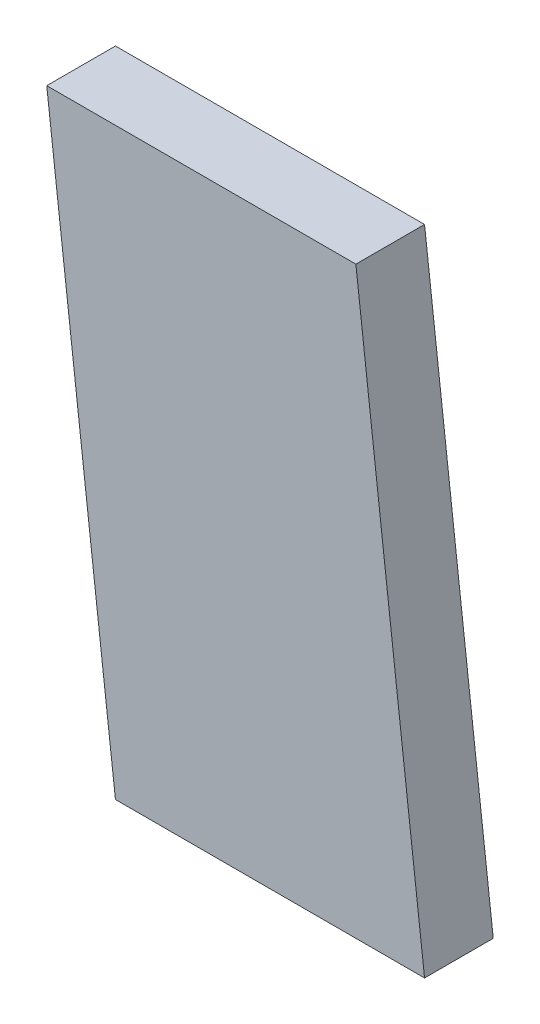
ISO-10303-21;
HEADER;
FILE_DESCRIPTION(('STEP AP214'),'2;1');
FILE_NAME('part.step','',(''),(''),'','','');
FILE_SCHEMA(('AUTOMOTIVE_DESIGN { 1 0 10303 214 1 1 1 1 }'));
ENDSEC;
DATA;
#1=APPLICATION_CONTEXT('core data for automotive mechanical design processes');
#2=APPLICATION_PROTOCOL_DEFINITION('international standard','automotive_design',2000,#1);
#3=PRODUCT_CONTEXT('',#1,'mechanical');
#4=PRODUCT('Part','Part','',(#3));
#5=PRODUCT_RELATED_PRODUCT_CATEGORY('part','',(#4));
#6=PRODUCT_DEFINITION_FORMATION('','',#4);
#7=PRODUCT_DEFINITION_CONTEXT('part definition',#1,'design');
#8=PRODUCT_DEFINITION('design','',#6,#7);
#9=PRODUCT_DEFINITION_SHAPE('','',#8);
#10=(LENGTH_UNIT() NAMED_UNIT(*) SI_UNIT(.MILLI.,.METRE.));
#11=(NAMED_UNIT(*) PLANE_ANGLE_UNIT() SI_UNIT($,.RADIAN.));
#12=(NAMED_UNIT(*) SI_UNIT($,.STERADIAN.) SOLID_ANGLE_UNIT());
#13=UNCERTAINTY_MEASURE_WITH_UNIT(LENGTH_MEASURE(1.E-05),#10,'distance_accuracy_value','');
#14=(GEOMETRIC_REPRESENTATION_CONTEXT(3) GLOBAL_UNCERTAINTY_ASSIGNED_CONTEXT((#13)) GLOBAL_UNIT_ASSIGNED_CONTEXT((#10,
#11,#12)) REPRESENTATION_CONTEXT('',''));
#15=CARTESIAN_POINT('',(0.,0.,0.));
#16=DIRECTION('',(0.,0.,1.));
#17=DIRECTION('',(1.,0.,0.));
#18=AXIS2_PLACEMENT_3D('',#15,#16,#17);
#19=CARTESIAN_POINT('',(5290.,490.,20.));
#20=DIRECTION('',(0.,1.,0.));
#21=DIRECTION('',(0.,0.,1.));
#22=AXIS2_PLACEMENT_3D('',#19,#20,#21);
#23=PLANE('',#22);
#24=DIRECTION('',(1.,0.,0.));
#25=VECTOR('',#24,1.);
#26=CARTESIAN_POINT('',(5290.,490.,0.));
#27=LINE('',#26,#25);
#28=CARTESIAN_POINT('',(5200.,490.,0.));
#29=VERTEX_POINT('',#28);
#30=CARTESIAN_POINT('',(5290.,490.,0.));
#31=VERTEX_POINT('',#30);
#32=EDGE_CURVE('E105',#29,#31,#27,.T.);
#33=ORIENTED_EDGE('',*,*,#32,.T.);
#34=DIRECTION('',(0.,0.,-1.));
#35=VECTOR('',#34,1.);
#36=CARTESIAN_POINT('',(5290.,490.,20.));
#37=LINE('',#36,#35);
#38=CARTESIAN_POINT('',(5290.,490.,20.));
#39=VERTEX_POINT('',#38);
#40=EDGE_CURVE('E11',#39,#31,#37,.T.);
#41=ORIENTED_EDGE('',*,*,#40,.F.);
#42=DIRECTION('',(1.,0.,0.));
#43=VECTOR('',#42,1.);
#44=CARTESIAN_POINT('',(5290.,490.,20.));
#45=LINE('',#44,#43);
#46=CARTESIAN_POINT('',(5200.,490.,20.));
#47=VERTEX_POINT('',#46);
#48=EDGE_CURVE('E89',#47,#39,#45,.T.);
#49=ORIENTED_EDGE('',*,*,#48,.F.);
#50=DIRECTION('',(0.,0.,-1.));
#51=VECTOR('',#50,1.);
#52=CARTESIAN_POINT('',(5200.,490.,20.));
#53=LINE('',#52,#51);
#54=EDGE_CURVE('E97',#47,#29,#53,.T.);
#55=ORIENTED_EDGE('',*,*,#54,.T.);
#56=EDGE_LOOP('',(#33,#41,#49,#55));
#57=FACE_BOUND('',#56,.T.);
#58=ADVANCED_FACE('F39',(#57),#23,.F.);
#59=CARTESIAN_POINT('',(5270.,660.,20.));
#60=DIRECTION('',(-0.993150604322876,-0.1168412475674,0.));
#61=DIRECTION('',(0.1168412475674,-0.993150604322876,0.));
#62=AXIS2_PLACEMENT_3D('',#59,#60,#61);
#63=PLANE('',#62);
#64=DIRECTION('',(-0.1168412475674,0.993150604322876,0.));
#65=VECTOR('',#64,1.);
#66=CARTESIAN_POINT('',(5270.,660.,0.));
#67=LINE('',#66,#65);
#68=CARTESIAN_POINT('',(5270.,660.,0.));
#69=VERTEX_POINT('',#68);
#70=EDGE_CURVE('E92',#31,#69,#67,.T.);
#71=ORIENTED_EDGE('',*,*,#70,.T.);
#72=DIRECTION('',(0.,0.,-1.));
#73=VECTOR('',#72,1.);
#74=CARTESIAN_POINT('',(5270.,660.,20.));
#75=LINE('',#74,#73);
#76=CARTESIAN_POINT('',(5270.,660.,20.));
#77=VERTEX_POINT('',#76);
#78=EDGE_CURVE('E50',#77,#69,#75,.T.);
#79=ORIENTED_EDGE('',*,*,#78,.F.);
#80=DIRECTION('',(-0.1168412475674,0.993150604322876,0.));
#81=VECTOR('',#80,1.);
#82=CARTESIAN_POINT('',(5270.,660.,20.));
#83=LINE('',#82,#81);
#84=EDGE_CURVE('E82',#39,#77,#83,.T.);
#85=ORIENTED_EDGE('',*,*,#84,.F.);
#86=ORIENTED_EDGE('',*,*,#40,.T.);
#87=EDGE_LOOP('',(#71,#79,#85,#86));
#88=FACE_BOUND('',#87,.T.);
#89=ADVANCED_FACE('F93',(#88),#63,.F.);
#90=CARTESIAN_POINT('',(5180.,660.,20.));
#91=DIRECTION('',(0.,-1.,0.));
#92=DIRECTION('',(0.,0.,-1.));
#93=AXIS2_PLACEMENT_3D('',#90,#91,#92);
#94=PLANE('',#93);
#95=DIRECTION('',(-1.,0.,0.));
#96=VECTOR('',#95,1.);
#97=CARTESIAN_POINT('',(5180.,660.,0.));
#98=LINE('',#97,#96);
#99=CARTESIAN_POINT('',(5180.,660.,0.));
#100=VERTEX_POINT('',#99);
#101=EDGE_CURVE('E72',#69,#100,#98,.T.);
#102=ORIENTED_EDGE('',*,*,#101,.T.);
#103=DIRECTION('',(0.,0.,-1.));
#104=VECTOR('',#103,1.);
#105=CARTESIAN_POINT('',(5180.,660.,20.));
#106=LINE('',#105,#104);
#107=CARTESIAN_POINT('',(5180.,660.,20.));
#108=VERTEX_POINT('',#107);
#109=EDGE_CURVE('E94',#108,#100,#106,.T.);
#110=ORIENTED_EDGE('',*,*,#109,.F.);
#111=DIRECTION('',(-1.,0.,0.));
#112=VECTOR('',#111,1.);
#113=CARTESIAN_POINT('',(5180.,660.,20.));
#114=LINE('',#113,#112);
#115=EDGE_CURVE('E88',#77,#108,#114,.T.);
#116=ORIENTED_EDGE('',*,*,#115,.F.);
#117=ORIENTED_EDGE('',*,*,#78,.T.);
#118=EDGE_LOOP('',(#102,#110,#116,#117));
#119=FACE_BOUND('',#118,.T.);
#120=ADVANCED_FACE('F96',(#119),#94,.F.);
#121=CARTESIAN_POINT('',(5200.,490.,20.));
#122=DIRECTION('',(0.993150604322876,0.1168412475674,0.));
#123=DIRECTION('',(-0.1168412475674,0.993150604322876,0.));
#124=AXIS2_PLACEMENT_3D('',#121,#122,#123);
#125=PLANE('',#124);
#126=DIRECTION('',(0.1168412475674,-0.993150604322876,0.));
#127=VECTOR('',#126,1.);
#128=CARTESIAN_POINT('',(5200.,490.,0.));
#129=LINE('',#128,#127);
#130=EDGE_CURVE('E76',#100,#29,#129,.T.);
#131=ORIENTED_EDGE('',*,*,#130,.T.);
#132=ORIENTED_EDGE('',*,*,#54,.F.);
#133=DIRECTION('',(0.1168412475674,-0.993150604322876,0.));
#134=VECTOR('',#133,1.);
#135=CARTESIAN_POINT('',(5200.,490.,20.));
#136=LINE('',#135,#134);
#137=EDGE_CURVE('E54',#108,#47,#136,.T.);
#138=ORIENTED_EDGE('',*,*,#137,.F.);
#139=ORIENTED_EDGE('',*,*,#109,.T.);
#140=EDGE_LOOP('',(#131,#132,#138,#139));
#141=FACE_BOUND('',#140,.T.);
#142=ADVANCED_FACE('F108',(#141),#125,.F.);
#143=CARTESIAN_POINT('',(0.,0.,20.));
#144=DIRECTION('',(0.,0.,-1.));
#145=DIRECTION('',(-1.,0.,0.));
#146=AXIS2_PLACEMENT_3D('',#143,#144,#145);
#147=PLANE('',#146);
#148=ORIENTED_EDGE('',*,*,#48,.T.);
#149=ORIENTED_EDGE('',*,*,#84,.T.);
#150=ORIENTED_EDGE('',*,*,#115,.T.);
#151=ORIENTED_EDGE('',*,*,#137,.T.);
#152=EDGE_LOOP('',(#148,#149,#150,#151));
#153=FACE_BOUND('',#152,.T.);
#154=ADVANCED_FACE('F86',(#153),#147,.F.);
#155=CARTESIAN_POINT('',(0.,0.,0.));
#156=DIRECTION('',(0.,0.,-1.));
#157=DIRECTION('',(-1.,0.,0.));
#158=AXIS2_PLACEMENT_3D('',#155,#156,#157);
#159=PLANE('',#158);
#160=ORIENTED_EDGE('',*,*,#32,.F.);
#161=ORIENTED_EDGE('',*,*,#130,.F.);
#162=ORIENTED_EDGE('',*,*,#101,.F.);
#163=ORIENTED_EDGE('',*,*,#70,.F.);
#164=EDGE_LOOP('',(#160,#161,#162,#163));
#165=FACE_BOUND('',#164,.T.);
#166=ADVANCED_FACE('F115',(#165),#159,.T.);
#167=CLOSED_SHELL('',(#58,#89,#120,#142,#154,#166));
#168=MANIFOLD_SOLID_BREP('B2',#167);
#169=ADVANCED_BREP_SHAPE_REPRESENTATION('',(#18,#168),#14);
#170=SHAPE_DEFINITION_REPRESENTATION(#9,#169);
ENDSEC;
END-ISO-10303-21;
